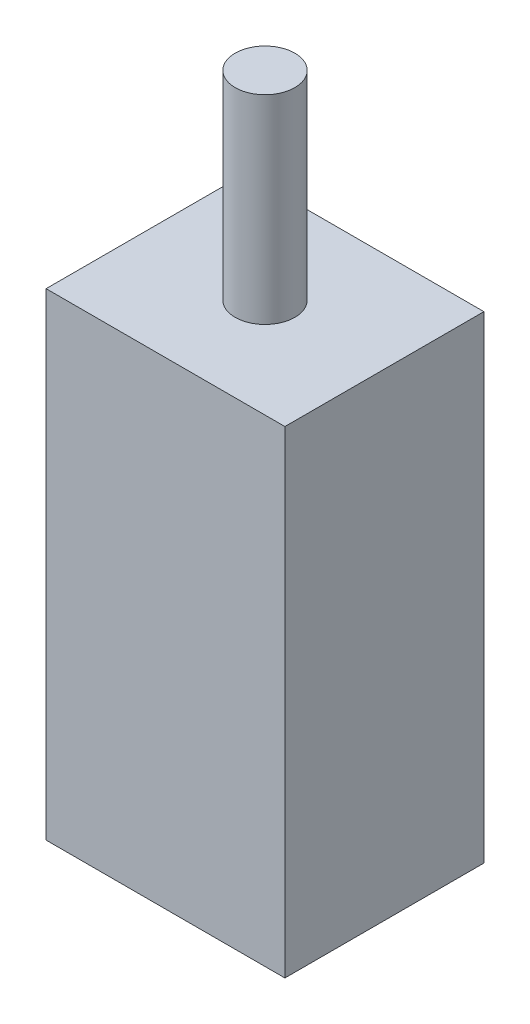
ISO-10303-21;
HEADER;
FILE_DESCRIPTION(('STEP AP214'),'2;1');
FILE_NAME('part.step','',(''),(''),'','','');
FILE_SCHEMA(('AUTOMOTIVE_DESIGN { 1 0 10303 214 1 1 1 1 }'));
ENDSEC;
DATA;
#1=APPLICATION_CONTEXT('core data for automotive mechanical design processes');
#2=APPLICATION_PROTOCOL_DEFINITION('international standard','automotive_design',2000,#1);
#3=PRODUCT_CONTEXT('',#1,'mechanical');
#4=PRODUCT('Part','Part','',(#3));
#5=PRODUCT_RELATED_PRODUCT_CATEGORY('part','',(#4));
#6=PRODUCT_DEFINITION_FORMATION('','',#4);
#7=PRODUCT_DEFINITION_CONTEXT('part definition',#1,'design');
#8=PRODUCT_DEFINITION('design','',#6,#7);
#9=PRODUCT_DEFINITION_SHAPE('','',#8);
#10=(LENGTH_UNIT() NAMED_UNIT(*) SI_UNIT(.MILLI.,.METRE.));
#11=(NAMED_UNIT(*) PLANE_ANGLE_UNIT() SI_UNIT($,.RADIAN.));
#12=(NAMED_UNIT(*) SI_UNIT($,.STERADIAN.) SOLID_ANGLE_UNIT());
#13=UNCERTAINTY_MEASURE_WITH_UNIT(LENGTH_MEASURE(1.E-05),#10,'distance_accuracy_value','');
#14=(GEOMETRIC_REPRESENTATION_CONTEXT(3) GLOBAL_UNCERTAINTY_ASSIGNED_CONTEXT((#13)) GLOBAL_UNIT_ASSIGNED_CONTEXT((#10,
#11,#12)) REPRESENTATION_CONTEXT('',''));
#15=CARTESIAN_POINT('',(0.,0.,0.));
#16=DIRECTION('',(0.,0.,1.));
#17=DIRECTION('',(1.,0.,0.));
#18=AXIS2_PLACEMENT_3D('',#15,#16,#17);
#19=CARTESIAN_POINT('',(6.,-12.,5.));
#20=DIRECTION('',(0.,1.,0.));
#21=DIRECTION('',(0.,0.,1.));
#22=AXIS2_PLACEMENT_3D('',#19,#20,#21);
#23=PLANE('',#22);
#24=DIRECTION('',(-1.,0.,0.));
#25=VECTOR('',#24,1.);
#26=CARTESIAN_POINT('',(-4.2,-12.,0.5));
#27=LINE('',#26,#25);
#28=CARTESIAN_POINT('',(-4.,-12.,0.5));
#29=VERTEX_POINT('',#28);
#30=CARTESIAN_POINT('',(-4.2,-12.,0.5));
#31=VERTEX_POINT('',#30);
#32=EDGE_CURVE('E205',#29,#31,#27,.T.);
#33=ORIENTED_EDGE('',*,*,#32,.F.);
#34=DIRECTION('',(0.,0.,1.));
#35=VECTOR('',#34,1.);
#36=CARTESIAN_POINT('',(-4.,-12.,0.5));
#37=LINE('',#36,#35);
#38=CARTESIAN_POINT('',(-4.,-12.,-0.5));
#39=VERTEX_POINT('',#38);
#40=EDGE_CURVE('E192',#39,#29,#37,.T.);
#41=ORIENTED_EDGE('',*,*,#40,.F.);
#42=DIRECTION('',(1.,0.,0.));
#43=VECTOR('',#42,1.);
#44=CARTESIAN_POINT('',(-4.2,-12.,-0.5));
#45=LINE('',#44,#43);
#46=CARTESIAN_POINT('',(-4.2,-12.,-0.5));
#47=VERTEX_POINT('',#46);
#48=EDGE_CURVE('E196',#47,#39,#45,.T.);
#49=ORIENTED_EDGE('',*,*,#48,.F.);
#50=DIRECTION('',(0.,0.,-1.));
#51=VECTOR('',#50,1.);
#52=CARTESIAN_POINT('',(-4.2,-12.,0.5));
#53=LINE('',#52,#51);
#54=EDGE_CURVE('E201',#31,#47,#53,.T.);
#55=ORIENTED_EDGE('',*,*,#54,.F.);
#56=EDGE_LOOP('',(#33,#41,#49,#55));
#57=FACE_BOUND('',#56,.T.);
#58=DIRECTION('',(1.,0.,0.));
#59=VECTOR('',#58,1.);
#60=CARTESIAN_POINT('',(6.,-12.,-5.));
#61=LINE('',#60,#59);
#62=CARTESIAN_POINT('',(-6.,-12.,-5.));
#63=VERTEX_POINT('',#62);
#64=CARTESIAN_POINT('',(6.,-12.,-5.));
#65=VERTEX_POINT('',#64);
#66=EDGE_CURVE('E241',#63,#65,#61,.T.);
#67=ORIENTED_EDGE('',*,*,#66,.T.);
#68=DIRECTION('',(0.,0.,-1.));
#69=VECTOR('',#68,1.);
#70=CARTESIAN_POINT('',(6.,-12.,5.));
#71=LINE('',#70,#69);
#72=CARTESIAN_POINT('',(6.,-12.,5.));
#73=VERTEX_POINT('',#72);
#74=EDGE_CURVE('E249',#73,#65,#71,.T.);
#75=ORIENTED_EDGE('',*,*,#74,.F.);
#76=DIRECTION('',(1.,0.,0.));
#77=VECTOR('',#76,1.);
#78=CARTESIAN_POINT('',(6.,-12.,5.));
#79=LINE('',#78,#77);
#80=CARTESIAN_POINT('',(-6.,-12.,5.));
#81=VERTEX_POINT('',#80);
#82=EDGE_CURVE('E228',#81,#73,#79,.T.);
#83=ORIENTED_EDGE('',*,*,#82,.F.);
#84=DIRECTION('',(0.,0.,-1.));
#85=VECTOR('',#84,1.);
#86=CARTESIAN_POINT('',(-6.,-12.,5.));
#87=LINE('',#86,#85);
#88=EDGE_CURVE('E252',#81,#63,#87,.T.);
#89=ORIENTED_EDGE('',*,*,#88,.T.);
#90=EDGE_LOOP('',(#67,#75,#83,#89));
#91=FACE_BOUND('',#90,.T.);
#92=DIRECTION('',(0.,0.,-1.));
#93=VECTOR('',#92,1.);
#94=CARTESIAN_POINT('',(4.,-12.,0.5));
#95=LINE('',#94,#93);
#96=CARTESIAN_POINT('',(4.,-12.,0.5));
#97=VERTEX_POINT('',#96);
#98=CARTESIAN_POINT('',(4.,-12.,-0.5));
#99=VERTEX_POINT('',#98);
#100=EDGE_CURVE('E162',#97,#99,#95,.T.);
#101=ORIENTED_EDGE('',*,*,#100,.F.);
#102=DIRECTION('',(-1.,0.,0.));
#103=VECTOR('',#102,1.);
#104=CARTESIAN_POINT('',(4.2,-12.,0.5));
#105=LINE('',#104,#103);
#106=CARTESIAN_POINT('',(4.2,-12.,0.499999999999999));
#107=VERTEX_POINT('',#106);
#108=EDGE_CURVE('E159',#107,#97,#105,.T.);
#109=ORIENTED_EDGE('',*,*,#108,.F.);
#110=DIRECTION('',(0.,0.,1.));
#111=VECTOR('',#110,1.);
#112=CARTESIAN_POINT('',(4.2,-12.,0.5));
#113=LINE('',#112,#111);
#114=CARTESIAN_POINT('',(4.2,-12.,-0.5));
#115=VERTEX_POINT('',#114);
#116=EDGE_CURVE('E71',#115,#107,#113,.T.);
#117=ORIENTED_EDGE('',*,*,#116,.F.);
#118=DIRECTION('',(1.,0.,0.));
#119=VECTOR('',#118,1.);
#120=CARTESIAN_POINT('',(4.2,-12.,-0.5));
#121=LINE('',#120,#119);
#122=EDGE_CURVE('E66',#99,#115,#121,.T.);
#123=ORIENTED_EDGE('',*,*,#122,.F.);
#124=EDGE_LOOP('',(#101,#109,#117,#123));
#125=FACE_BOUND('',#124,.T.);
#126=ADVANCED_FACE('F49',(#57,#91,#125),#23,.F.);
#127=CARTESIAN_POINT('',(6.,12.,5.));
#128=DIRECTION('',(0.,-1.,0.));
#129=DIRECTION('',(0.,0.,-1.));
#130=AXIS2_PLACEMENT_3D('',#127,#128,#129);
#131=PLANE('',#130);
#132=CARTESIAN_POINT('',(0.,12.,0.));
#133=DIRECTION('',(0.,1.,0.));
#134=DIRECTION('',(0.,0.,1.));
#135=AXIS2_PLACEMENT_3D('',#132,#133,#134);
#136=CIRCLE('',#135,1.5);
#137=CARTESIAN_POINT('',(0.,12.,1.5));
#138=VERTEX_POINT('',#137);
#139=EDGE_CURVE('E11',#138,#138,#136,.T.);
#140=ORIENTED_EDGE('',*,*,#139,.F.);
#141=EDGE_LOOP('',(#140));
#142=FACE_BOUND('',#141,.T.);
#143=DIRECTION('',(-1.,0.,0.));
#144=VECTOR('',#143,1.);
#145=CARTESIAN_POINT('',(6.,12.,-5.));
#146=LINE('',#145,#144);
#147=CARTESIAN_POINT('',(6.,12.,-5.));
#148=VERTEX_POINT('',#147);
#149=CARTESIAN_POINT('',(-6.,12.,-5.));
#150=VERTEX_POINT('',#149);
#151=EDGE_CURVE('E169',#148,#150,#146,.T.);
#152=ORIENTED_EDGE('',*,*,#151,.T.);
#153=DIRECTION('',(0.,0.,-1.));
#154=VECTOR('',#153,1.);
#155=CARTESIAN_POINT('',(-6.,12.,5.));
#156=LINE('',#155,#154);
#157=CARTESIAN_POINT('',(-6.,12.,5.));
#158=VERTEX_POINT('',#157);
#159=EDGE_CURVE('E53',#158,#150,#156,.T.);
#160=ORIENTED_EDGE('',*,*,#159,.F.);
#161=DIRECTION('',(-1.,0.,0.));
#162=VECTOR('',#161,1.);
#163=CARTESIAN_POINT('',(6.,12.,5.));
#164=LINE('',#163,#162);
#165=CARTESIAN_POINT('',(6.,12.,5.));
#166=VERTEX_POINT('',#165);
#167=EDGE_CURVE('E220',#166,#158,#164,.T.);
#168=ORIENTED_EDGE('',*,*,#167,.F.);
#169=DIRECTION('',(0.,0.,-1.));
#170=VECTOR('',#169,1.);
#171=CARTESIAN_POINT('',(6.,12.,5.));
#172=LINE('',#171,#170);
#173=EDGE_CURVE('E234',#166,#148,#172,.T.);
#174=ORIENTED_EDGE('',*,*,#173,.T.);
#175=EDGE_LOOP('',(#152,#160,#168,#174));
#176=FACE_BOUND('',#175,.T.);
#177=ADVANCED_FACE('F51',(#142,#176),#131,.F.);
#178=CARTESIAN_POINT('',(-6.,-12.,5.));
#179=DIRECTION('',(1.,0.,0.));
#180=DIRECTION('',(0.,0.,-1.));
#181=AXIS2_PLACEMENT_3D('',#178,#179,#180);
#182=PLANE('',#181);
#183=DIRECTION('',(0.,-1.,0.));
#184=VECTOR('',#183,1.);
#185=CARTESIAN_POINT('',(-6.,-12.,-5.));
#186=LINE('',#185,#184);
#187=EDGE_CURVE('E238',#150,#63,#186,.T.);
#188=ORIENTED_EDGE('',*,*,#187,.T.);
#189=ORIENTED_EDGE('',*,*,#88,.F.);
#190=DIRECTION('',(0.,-1.,0.));
#191=VECTOR('',#190,1.);
#192=CARTESIAN_POINT('',(-6.,-12.,5.));
#193=LINE('',#192,#191);
#194=EDGE_CURVE('E224',#158,#81,#193,.T.);
#195=ORIENTED_EDGE('',*,*,#194,.F.);
#196=ORIENTED_EDGE('',*,*,#159,.T.);
#197=EDGE_LOOP('',(#188,#189,#195,#196));
#198=FACE_BOUND('',#197,.T.);
#199=ADVANCED_FACE('F263',(#198),#182,.F.);
#200=CARTESIAN_POINT('',(6.,-12.,5.));
#201=DIRECTION('',(-1.,0.,0.));
#202=DIRECTION('',(0.,0.,1.));
#203=AXIS2_PLACEMENT_3D('',#200,#201,#202);
#204=PLANE('',#203);
#205=DIRECTION('',(0.,1.,0.));
#206=VECTOR('',#205,1.);
#207=CARTESIAN_POINT('',(6.,-12.,-5.));
#208=LINE('',#207,#206);
#209=EDGE_CURVE('E225',#65,#148,#208,.T.);
#210=ORIENTED_EDGE('',*,*,#209,.T.);
#211=ORIENTED_EDGE('',*,*,#173,.F.);
#212=DIRECTION('',(0.,1.,0.));
#213=VECTOR('',#212,1.);
#214=CARTESIAN_POINT('',(6.,-12.,5.));
#215=LINE('',#214,#213);
#216=EDGE_CURVE('E231',#73,#166,#215,.T.);
#217=ORIENTED_EDGE('',*,*,#216,.F.);
#218=ORIENTED_EDGE('',*,*,#74,.T.);
#219=EDGE_LOOP('',(#210,#211,#217,#218));
#220=FACE_BOUND('',#219,.T.);
#221=ADVANCED_FACE('F274',(#220),#204,.F.);
#222=CARTESIAN_POINT('',(0.,0.,5.));
#223=DIRECTION('',(0.,0.,-1.));
#224=DIRECTION('',(-1.,0.,0.));
#225=AXIS2_PLACEMENT_3D('',#222,#223,#224);
#226=PLANE('',#225);
#227=ORIENTED_EDGE('',*,*,#167,.T.);
#228=ORIENTED_EDGE('',*,*,#194,.T.);
#229=ORIENTED_EDGE('',*,*,#82,.T.);
#230=ORIENTED_EDGE('',*,*,#216,.T.);
#231=EDGE_LOOP('',(#227,#228,#229,#230));
#232=FACE_BOUND('',#231,.T.);
#233=ADVANCED_FACE('F276',(#232),#226,.F.);
#234=CARTESIAN_POINT('',(0.,0.,-5.));
#235=DIRECTION('',(0.,0.,-1.));
#236=DIRECTION('',(-1.,0.,0.));
#237=AXIS2_PLACEMENT_3D('',#234,#235,#236);
#238=PLANE('',#237);
#239=ORIENTED_EDGE('',*,*,#151,.F.);
#240=ORIENTED_EDGE('',*,*,#209,.F.);
#241=ORIENTED_EDGE('',*,*,#66,.F.);
#242=ORIENTED_EDGE('',*,*,#187,.F.);
#243=EDGE_LOOP('',(#239,#240,#241,#242));
#244=FACE_BOUND('',#243,.T.);
#245=ADVANCED_FACE('F270',(#244),#238,.T.);
#246=CARTESIAN_POINT('',(0.,22.,0.));
#247=DIRECTION('',(0.,-1.,0.));
#248=DIRECTION('',(0.,0.,-1.));
#249=AXIS2_PLACEMENT_3D('',#246,#247,#248);
#250=CYLINDRICAL_SURFACE('',#249,1.5);
#251=CARTESIAN_POINT('',(0.,22.,0.));
#252=DIRECTION('',(0.,1.,0.));
#253=DIRECTION('',(0.,0.,1.));
#254=AXIS2_PLACEMENT_3D('',#251,#252,#253);
#255=CIRCLE('',#254,1.5);
#256=CARTESIAN_POINT('',(0.,22.,1.5));
#257=VERTEX_POINT('',#256);
#258=EDGE_CURVE('E164',#257,#257,#255,.T.);
#259=ORIENTED_EDGE('',*,*,#258,.F.);
#260=EDGE_LOOP('',(#259));
#261=FACE_BOUND('',#260,.T.);
#262=ORIENTED_EDGE('',*,*,#139,.T.);
#263=EDGE_LOOP('',(#262));
#264=FACE_BOUND('',#263,.T.);
#265=ADVANCED_FACE('F283',(#261,#264),#250,.T.);
#266=CARTESIAN_POINT('',(0.,22.,0.));
#267=DIRECTION('',(0.,1.,0.));
#268=DIRECTION('',(0.,0.,1.));
#269=AXIS2_PLACEMENT_3D('',#266,#267,#268);
#270=PLANE('',#269);
#271=ORIENTED_EDGE('',*,*,#258,.T.);
#272=EDGE_LOOP('',(#271));
#273=FACE_BOUND('',#272,.T.);
#274=ADVANCED_FACE('F325',(#273),#270,.T.);
#275=CARTESIAN_POINT('',(-4.2,-13.,0.5));
#276=DIRECTION('',(0.,0.,-1.));
#277=DIRECTION('',(-1.,0.,0.));
#278=AXIS2_PLACEMENT_3D('',#275,#276,#277);
#279=PLANE('',#278);
#280=ORIENTED_EDGE('',*,*,#32,.T.);
#281=DIRECTION('',(0.,1.,0.));
#282=VECTOR('',#281,1.);
#283=CARTESIAN_POINT('',(-4.2,-13.,0.5));
#284=LINE('',#283,#282);
#285=CARTESIAN_POINT('',(-4.2,-13.,0.5));
#286=VERTEX_POINT('',#285);
#287=EDGE_CURVE('E175',#286,#31,#284,.T.);
#288=ORIENTED_EDGE('',*,*,#287,.F.);
#289=DIRECTION('',(-1.,0.,0.));
#290=VECTOR('',#289,1.);
#291=CARTESIAN_POINT('',(-4.2,-13.,0.5));
#292=LINE('',#291,#290);
#293=CARTESIAN_POINT('',(-4.,-13.,0.5));
#294=VERTEX_POINT('',#293);
#295=EDGE_CURVE('E197',#294,#286,#292,.T.);
#296=ORIENTED_EDGE('',*,*,#295,.F.);
#297=DIRECTION('',(0.,1.,0.));
#298=VECTOR('',#297,1.);
#299=CARTESIAN_POINT('',(-4.,-13.,0.5));
#300=LINE('',#299,#298);
#301=EDGE_CURVE('E187',#294,#29,#300,.T.);
#302=ORIENTED_EDGE('',*,*,#301,.T.);
#303=EDGE_LOOP('',(#280,#288,#296,#302));
#304=FACE_BOUND('',#303,.T.);
#305=ADVANCED_FACE('F320',(#304),#279,.F.);
#306=CARTESIAN_POINT('',(-4.2,-13.,0.5));
#307=DIRECTION('',(1.,0.,0.));
#308=DIRECTION('',(0.,0.,-1.));
#309=AXIS2_PLACEMENT_3D('',#306,#307,#308);
#310=PLANE('',#309);
#311=ORIENTED_EDGE('',*,*,#54,.T.);
#312=DIRECTION('',(0.,1.,0.));
#313=VECTOR('',#312,1.);
#314=CARTESIAN_POINT('',(-4.2,-13.,-0.5));
#315=LINE('',#314,#313);
#316=CARTESIAN_POINT('',(-4.2,-13.,-0.5));
#317=VERTEX_POINT('',#316);
#318=EDGE_CURVE('E179',#317,#47,#315,.T.);
#319=ORIENTED_EDGE('',*,*,#318,.F.);
#320=DIRECTION('',(0.,0.,-1.));
#321=VECTOR('',#320,1.);
#322=CARTESIAN_POINT('',(-4.2,-13.,0.5));
#323=LINE('',#322,#321);
#324=EDGE_CURVE('E214',#286,#317,#323,.T.);
#325=ORIENTED_EDGE('',*,*,#324,.F.);
#326=ORIENTED_EDGE('',*,*,#287,.T.);
#327=EDGE_LOOP('',(#311,#319,#325,#326));
#328=FACE_BOUND('',#327,.T.);
#329=ADVANCED_FACE('F324',(#328),#310,.F.);
#330=CARTESIAN_POINT('',(-4.2,-13.,-0.5));
#331=DIRECTION('',(0.,0.,1.));
#332=DIRECTION('',(1.,0.,0.));
#333=AXIS2_PLACEMENT_3D('',#330,#331,#332);
#334=PLANE('',#333);
#335=ORIENTED_EDGE('',*,*,#48,.T.);
#336=DIRECTION('',(0.,1.,0.));
#337=VECTOR('',#336,1.);
#338=CARTESIAN_POINT('',(-4.,-13.,-0.5));
#339=LINE('',#338,#337);
#340=CARTESIAN_POINT('',(-4.,-13.,-0.5));
#341=VERTEX_POINT('',#340);
#342=EDGE_CURVE('E183',#341,#39,#339,.T.);
#343=ORIENTED_EDGE('',*,*,#342,.F.);
#344=DIRECTION('',(1.,0.,0.));
#345=VECTOR('',#344,1.);
#346=CARTESIAN_POINT('',(-4.2,-13.,-0.5));
#347=LINE('',#346,#345);
#348=EDGE_CURVE('E211',#317,#341,#347,.T.);
#349=ORIENTED_EDGE('',*,*,#348,.F.);
#350=ORIENTED_EDGE('',*,*,#318,.T.);
#351=EDGE_LOOP('',(#335,#343,#349,#350));
#352=FACE_BOUND('',#351,.T.);
#353=ADVANCED_FACE('F336',(#352),#334,.F.);
#354=CARTESIAN_POINT('',(-4.,-13.,0.5));
#355=DIRECTION('',(-1.,0.,0.));
#356=DIRECTION('',(0.,0.,1.));
#357=AXIS2_PLACEMENT_3D('',#354,#355,#356);
#358=PLANE('',#357);
#359=ORIENTED_EDGE('',*,*,#40,.T.);
#360=ORIENTED_EDGE('',*,*,#301,.F.);
#361=DIRECTION('',(0.,0.,1.));
#362=VECTOR('',#361,1.);
#363=CARTESIAN_POINT('',(-4.,-13.,0.5));
#364=LINE('',#363,#362);
#365=EDGE_CURVE('E191',#341,#294,#364,.T.);
#366=ORIENTED_EDGE('',*,*,#365,.F.);
#367=ORIENTED_EDGE('',*,*,#342,.T.);
#368=EDGE_LOOP('',(#359,#360,#366,#367));
#369=FACE_BOUND('',#368,.T.);
#370=ADVANCED_FACE('F346',(#369),#358,.F.);
#371=CARTESIAN_POINT('',(0.,-13.,0.));
#372=DIRECTION('',(0.,1.,0.));
#373=DIRECTION('',(0.,0.,1.));
#374=AXIS2_PLACEMENT_3D('',#371,#372,#373);
#375=PLANE('',#374);
#376=ORIENTED_EDGE('',*,*,#295,.T.);
#377=ORIENTED_EDGE('',*,*,#324,.T.);
#378=ORIENTED_EDGE('',*,*,#348,.T.);
#379=ORIENTED_EDGE('',*,*,#365,.T.);
#380=EDGE_LOOP('',(#376,#377,#378,#379));
#381=FACE_BOUND('',#380,.T.);
#382=ADVANCED_FACE('F356',(#381),#375,.F.);
#383=CARTESIAN_POINT('',(4.,-13.,0.5));
#384=DIRECTION('',(1.,0.,0.));
#385=DIRECTION('',(0.,0.,-1.));
#386=AXIS2_PLACEMENT_3D('',#383,#384,#385);
#387=PLANE('',#386);
#388=ORIENTED_EDGE('',*,*,#100,.T.);
#389=DIRECTION('',(0.,1.,0.));
#390=VECTOR('',#389,1.);
#391=CARTESIAN_POINT('',(4.,-13.,-0.5));
#392=LINE('',#391,#390);
#393=CARTESIAN_POINT('',(4.,-13.,-0.5));
#394=VERTEX_POINT('',#393);
#395=EDGE_CURVE('E141',#394,#99,#392,.T.);
#396=ORIENTED_EDGE('',*,*,#395,.F.);
#397=DIRECTION('',(0.,0.,-1.));
#398=VECTOR('',#397,1.);
#399=CARTESIAN_POINT('',(4.,-13.,0.5));
#400=LINE('',#399,#398);
#401=CARTESIAN_POINT('',(4.,-13.,0.5));
#402=VERTEX_POINT('',#401);
#403=EDGE_CURVE('E149',#402,#394,#400,.T.);
#404=ORIENTED_EDGE('',*,*,#403,.F.);
#405=DIRECTION('',(0.,1.,0.));
#406=VECTOR('',#405,1.);
#407=CARTESIAN_POINT('',(4.,-13.,0.5));
#408=LINE('',#407,#406);
#409=EDGE_CURVE('E508',#402,#97,#408,.T.);
#410=ORIENTED_EDGE('',*,*,#409,.T.);
#411=EDGE_LOOP('',(#388,#396,#404,#410));
#412=FACE_BOUND('',#411,.T.);
#413=ADVANCED_FACE('F161',(#412),#387,.F.);
#414=CARTESIAN_POINT('',(4.2,-13.,-0.5));
#415=DIRECTION('',(0.,0.,1.));
#416=DIRECTION('',(1.,0.,0.));
#417=AXIS2_PLACEMENT_3D('',#414,#415,#416);
#418=PLANE('',#417);
#419=ORIENTED_EDGE('',*,*,#122,.T.);
#420=DIRECTION('',(0.,1.,0.));
#421=VECTOR('',#420,1.);
#422=CARTESIAN_POINT('',(4.2,-13.,-0.5));
#423=LINE('',#422,#421);
#424=CARTESIAN_POINT('',(4.2,-13.,-0.5));
#425=VERTEX_POINT('',#424);
#426=EDGE_CURVE('E144',#425,#115,#423,.T.);
#427=ORIENTED_EDGE('',*,*,#426,.F.);
#428=DIRECTION('',(1.,0.,0.));
#429=VECTOR('',#428,1.);
#430=CARTESIAN_POINT('',(4.2,-13.,-0.5));
#431=LINE('',#430,#429);
#432=EDGE_CURVE('E137',#394,#425,#431,.T.);
#433=ORIENTED_EDGE('',*,*,#432,.F.);
#434=ORIENTED_EDGE('',*,*,#395,.T.);
#435=EDGE_LOOP('',(#419,#427,#433,#434));
#436=FACE_BOUND('',#435,.T.);
#437=ADVANCED_FACE('F139',(#436),#418,.F.);
#438=CARTESIAN_POINT('',(4.2,-13.,0.5));
#439=DIRECTION('',(-1.,0.,0.));
#440=DIRECTION('',(0.,0.,1.));
#441=AXIS2_PLACEMENT_3D('',#438,#439,#440);
#442=PLANE('',#441);
#443=ORIENTED_EDGE('',*,*,#116,.T.);
#444=DIRECTION('',(0.,1.,0.));
#445=VECTOR('',#444,1.);
#446=CARTESIAN_POINT('',(4.2,-13.,0.5));
#447=LINE('',#446,#445);
#448=CARTESIAN_POINT('',(4.2,-13.,0.5));
#449=VERTEX_POINT('',#448);
#450=EDGE_CURVE('E171',#449,#107,#447,.T.);
#451=ORIENTED_EDGE('',*,*,#450,.F.);
#452=DIRECTION('',(0.,0.,1.));
#453=VECTOR('',#452,1.);
#454=CARTESIAN_POINT('',(4.2,-13.,0.5));
#455=LINE('',#454,#453);
#456=EDGE_CURVE('E148',#425,#449,#455,.T.);
#457=ORIENTED_EDGE('',*,*,#456,.F.);
#458=ORIENTED_EDGE('',*,*,#426,.T.);
#459=EDGE_LOOP('',(#443,#451,#457,#458));
#460=FACE_BOUND('',#459,.T.);
#461=ADVANCED_FACE('F383',(#460),#442,.F.);
#462=CARTESIAN_POINT('',(4.2,-13.,0.5));
#463=DIRECTION('',(0.,0.,-1.));
#464=DIRECTION('',(-1.,0.,0.));
#465=AXIS2_PLACEMENT_3D('',#462,#463,#464);
#466=PLANE('',#465);
#467=ORIENTED_EDGE('',*,*,#108,.T.);
#468=ORIENTED_EDGE('',*,*,#409,.F.);
#469=DIRECTION('',(-1.,0.,0.));
#470=VECTOR('',#469,1.);
#471=CARTESIAN_POINT('',(4.2,-13.,0.5));
#472=LINE('',#471,#470);
#473=EDGE_CURVE('E154',#449,#402,#472,.T.);
#474=ORIENTED_EDGE('',*,*,#473,.F.);
#475=ORIENTED_EDGE('',*,*,#450,.T.);
#476=EDGE_LOOP('',(#467,#468,#474,#475));
#477=FACE_BOUND('',#476,.T.);
#478=ADVANCED_FACE('F392',(#477),#466,.F.);
#479=CARTESIAN_POINT('',(0.,-13.,0.));
#480=DIRECTION('',(0.,1.,0.));
#481=DIRECTION('',(0.,0.,1.));
#482=AXIS2_PLACEMENT_3D('',#479,#480,#481);
#483=PLANE('',#482);
#484=ORIENTED_EDGE('',*,*,#403,.T.);
#485=ORIENTED_EDGE('',*,*,#432,.T.);
#486=ORIENTED_EDGE('',*,*,#456,.T.);
#487=ORIENTED_EDGE('',*,*,#473,.T.);
#488=EDGE_LOOP('',(#484,#485,#486,#487));
#489=FACE_BOUND('',#488,.T.);
#490=ADVANCED_FACE('F152',(#489),#483,.F.);
#491=CLOSED_SHELL('',(#126,#177,#199,#221,#233,#245,#265,#274,#305,#329,#353,#370,#382,#413,
#437,#461,#478,#490));
#492=MANIFOLD_SOLID_BREP('B2',#491);
#493=ADVANCED_BREP_SHAPE_REPRESENTATION('',(#18,#492),#14);
#494=SHAPE_DEFINITION_REPRESENTATION(#9,#493);
ENDSEC;
END-ISO-10303-21;
